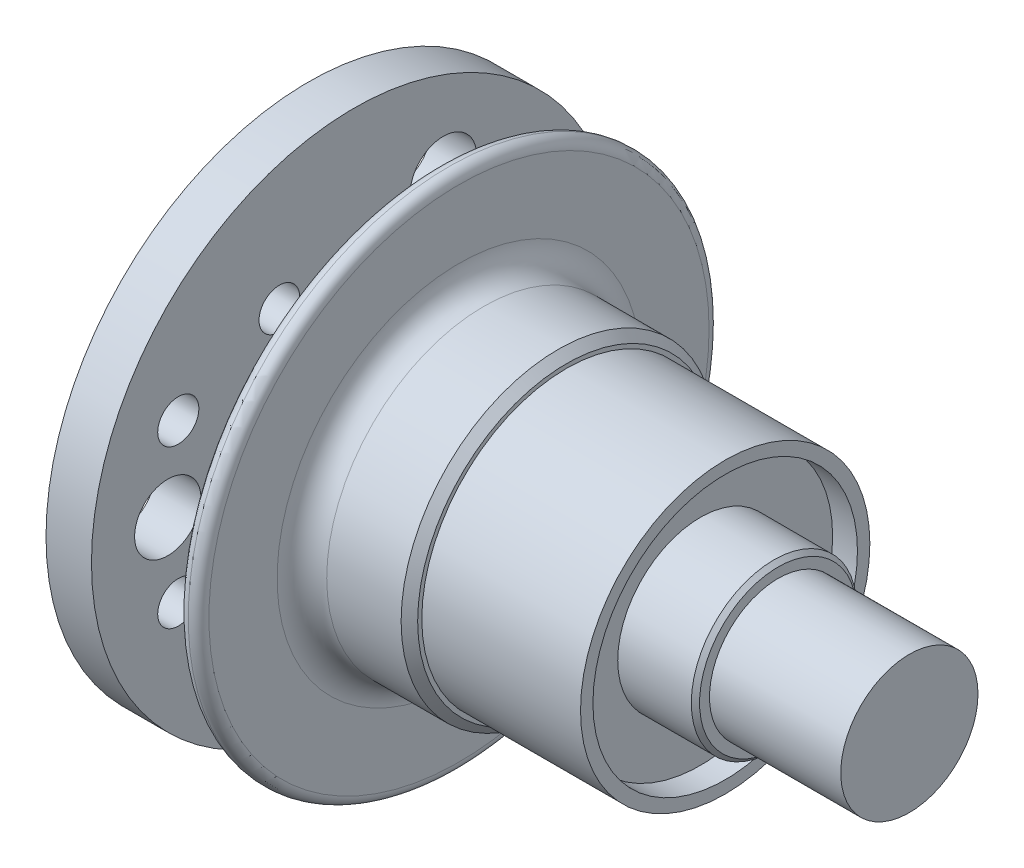
ISO-10303-21;
HEADER;
FILE_DESCRIPTION(('STEP AP214'),'2;1');
FILE_NAME('part.step','',(''),(''),'','','');
FILE_SCHEMA(('AUTOMOTIVE_DESIGN { 1 0 10303 214 1 1 1 1 }'));
ENDSEC;
DATA;
#1=APPLICATION_CONTEXT('core data for automotive mechanical design processes');
#2=APPLICATION_PROTOCOL_DEFINITION('international standard','automotive_design',2000,#1);
#3=PRODUCT_CONTEXT('',#1,'mechanical');
#4=PRODUCT('Part','Part','',(#3));
#5=PRODUCT_RELATED_PRODUCT_CATEGORY('part','',(#4));
#6=PRODUCT_DEFINITION_FORMATION('','',#4);
#7=PRODUCT_DEFINITION_CONTEXT('part definition',#1,'design');
#8=PRODUCT_DEFINITION('design','',#6,#7);
#9=PRODUCT_DEFINITION_SHAPE('','',#8);
#10=(LENGTH_UNIT() NAMED_UNIT(*) SI_UNIT(.MILLI.,.METRE.));
#11=(NAMED_UNIT(*) PLANE_ANGLE_UNIT() SI_UNIT($,.RADIAN.));
#12=(NAMED_UNIT(*) SI_UNIT($,.STERADIAN.) SOLID_ANGLE_UNIT());
#13=UNCERTAINTY_MEASURE_WITH_UNIT(LENGTH_MEASURE(1.E-05),#10,'distance_accuracy_value','');
#14=(GEOMETRIC_REPRESENTATION_CONTEXT(3) GLOBAL_UNCERTAINTY_ASSIGNED_CONTEXT((#13)) GLOBAL_UNIT_ASSIGNED_CONTEXT((#10,
#11,#12)) REPRESENTATION_CONTEXT('',''));
#15=CARTESIAN_POINT('',(0.,0.,0.));
#16=DIRECTION('',(0.,0.,1.));
#17=DIRECTION('',(1.,0.,0.));
#18=AXIS2_PLACEMENT_3D('',#15,#16,#17);
#19=CARTESIAN_POINT('',(20.5,0.,0.));
#20=DIRECTION('',(-1.,0.,0.));
#21=DIRECTION('',(0.,0.,1.));
#22=AXIS2_PLACEMENT_3D('',#19,#20,#21);
#23=CYLINDRICAL_SURFACE('',#22,10.);
#24=CARTESIAN_POINT('',(12.,0.,0.));
#25=DIRECTION('',(-1.,0.,0.));
#26=DIRECTION('',(0.,0.,1.));
#27=AXIS2_PLACEMENT_3D('',#24,#25,#26);
#28=CIRCLE('',#27,10.);
#29=CARTESIAN_POINT('',(12.,0.,10.));
#30=VERTEX_POINT('',#29);
#31=EDGE_CURVE('E53',#30,#30,#28,.F.);
#32=ORIENTED_EDGE('',*,*,#31,.T.);
#33=EDGE_LOOP('',(#32));
#34=FACE_BOUND('',#33,.T.);
#35=CARTESIAN_POINT('',(20.5,0.,0.));
#36=DIRECTION('',(1.,0.,0.));
#37=DIRECTION('',(0.,0.,-1.));
#38=AXIS2_PLACEMENT_3D('',#35,#36,#37);
#39=CIRCLE('',#38,10.);
#40=CARTESIAN_POINT('',(20.5,0.,-10.));
#41=VERTEX_POINT('',#40);
#42=EDGE_CURVE('E151',#41,#41,#39,.T.);
#43=ORIENTED_EDGE('',*,*,#42,.F.);
#44=EDGE_LOOP('',(#43));
#45=FACE_BOUND('',#44,.T.);
#46=ADVANCED_FACE('F45',(#34,#45),#23,.T.);
#47=CARTESIAN_POINT('',(23.,0.,0.));
#48=DIRECTION('',(1.,0.,0.));
#49=DIRECTION('',(0.,0.,-1.));
#50=AXIS2_PLACEMENT_3D('',#47,#48,#49);
#51=PLANE('',#50);
#52=CARTESIAN_POINT('',(23.,0.,0.));
#53=DIRECTION('',(1.,0.,0.));
#54=DIRECTION('',(0.,0.,-1.));
#55=AXIS2_PLACEMENT_3D('',#52,#53,#54);
#56=CIRCLE('',#55,30.25);
#57=CARTESIAN_POINT('',(23.,0.,-30.25));
#58=VERTEX_POINT('',#57);
#59=EDGE_CURVE('E58',#58,#58,#56,.T.);
#60=ORIENTED_EDGE('',*,*,#59,.T.);
#61=EDGE_LOOP('',(#60));
#62=FACE_BOUND('',#61,.T.);
#63=CARTESIAN_POINT('',(23.,0.,0.));
#64=DIRECTION('',(1.,0.,0.));
#65=DIRECTION('',(0.,0.,-1.));
#66=AXIS2_PLACEMENT_3D('',#63,#64,#65);
#67=CIRCLE('',#66,22.);
#68=CARTESIAN_POINT('',(23.,0.,-22.));
#69=VERTEX_POINT('',#68);
#70=EDGE_CURVE('E174',#69,#69,#67,.F.);
#71=ORIENTED_EDGE('',*,*,#70,.T.);
#72=EDGE_LOOP('',(#71));
#73=FACE_BOUND('',#72,.T.);
#74=ADVANCED_FACE('F202',(#62,#73),#51,.T.);
#75=CARTESIAN_POINT('',(20.5,0.,0.));
#76=DIRECTION('',(1.,0.,0.));
#77=DIRECTION('',(0.,0.,-1.));
#78=AXIS2_PLACEMENT_3D('',#75,#76,#77);
#79=PLANE('',#78);
#80=CARTESIAN_POINT('',(20.5,0.,0.));
#81=DIRECTION('',(1.,0.,0.));
#82=DIRECTION('',(0.,0.,-1.));
#83=AXIS2_PLACEMENT_3D('',#80,#81,#82);
#84=CIRCLE('',#83,30.25);
#85=CARTESIAN_POINT('',(20.5,0.,-30.25));
#86=VERTEX_POINT('',#85);
#87=EDGE_CURVE('E177',#86,#86,#84,.F.);
#88=ORIENTED_EDGE('',*,*,#87,.T.);
#89=EDGE_LOOP('',(#88));
#90=FACE_BOUND('',#89,.T.);
#91=ORIENTED_EDGE('',*,*,#42,.T.);
#92=EDGE_LOOP('',(#91));
#93=FACE_BOUND('',#92,.T.);
#94=ADVANCED_FACE('F208',(#90,#93),#79,.F.);
#95=CARTESIAN_POINT('',(36.,0.,0.));
#96=DIRECTION('',(-1.,0.,0.));
#97=DIRECTION('',(0.,0.,1.));
#98=AXIS2_PLACEMENT_3D('',#95,#96,#97);
#99=CYLINDRICAL_SURFACE('',#98,19.);
#100=CARTESIAN_POINT('',(26.,0.,0.));
#101=DIRECTION('',(1.,0.,0.));
#102=DIRECTION('',(0.,0.,-1.));
#103=AXIS2_PLACEMENT_3D('',#100,#101,#102);
#104=CIRCLE('',#103,19.);
#105=CARTESIAN_POINT('',(26.,0.,19.));
#106=VERTEX_POINT('',#105);
#107=EDGE_CURVE('E171',#106,#106,#104,.T.);
#108=CARTESIAN_POINT('',(35.0000000000001,0.,0.));
#109=DIRECTION('',(1.,0.,0.));
#110=DIRECTION('',(0.,0.,-1.));
#111=AXIS2_PLACEMENT_3D('',#108,#109,#110);
#112=CIRCLE('',#111,19.);
#113=CARTESIAN_POINT('',(35.0000000000001,0.,19.));
#114=VERTEX_POINT('',#113);
#115=EDGE_CURVE('E131',#114,#114,#112,.F.);
#116=CARTESIAN_POINT('',(26.,0.,19.));
#117=CARTESIAN_POINT('',(26.09375,0.,19.));
#118=CARTESIAN_POINT('',(26.1875,0.,19.));
#119=CARTESIAN_POINT('',(26.375,0.,19.));
#120=CARTESIAN_POINT('',(26.46875,0.,19.));
#121=CARTESIAN_POINT('',(26.65625,0.,19.));
#122=CARTESIAN_POINT('',(26.75,0.,19.));
#123=CARTESIAN_POINT('',(26.9375,0.,19.));
#124=CARTESIAN_POINT('',(27.03125,0.,19.));
#125=CARTESIAN_POINT('',(27.21875,0.,19.));
#126=CARTESIAN_POINT('',(27.3125,0.,19.));
#127=CARTESIAN_POINT('',(27.5,0.,19.));
#128=CARTESIAN_POINT('',(27.59375,0.,19.));
#129=CARTESIAN_POINT('',(27.78125,0.,19.));
#130=CARTESIAN_POINT('',(27.875,0.,19.));
#131=CARTESIAN_POINT('',(28.0625,0.,19.));
#132=CARTESIAN_POINT('',(28.15625,0.,19.));
#133=CARTESIAN_POINT('',(28.34375,0.,19.));
#134=CARTESIAN_POINT('',(28.4375,0.,19.));
#135=CARTESIAN_POINT('',(28.625,0.,19.));
#136=CARTESIAN_POINT('',(28.71875,0.,19.));
#137=CARTESIAN_POINT('',(28.90625,0.,19.));
#138=CARTESIAN_POINT('',(29.,0.,19.));
#139=CARTESIAN_POINT('',(29.1875,0.,19.));
#140=CARTESIAN_POINT('',(29.28125,0.,19.));
#141=CARTESIAN_POINT('',(29.46875,0.,19.));
#142=CARTESIAN_POINT('',(29.5625,0.,19.));
#143=CARTESIAN_POINT('',(29.75,0.,19.));
#144=CARTESIAN_POINT('',(29.84375,0.,19.));
#145=CARTESIAN_POINT('',(30.03125,0.,19.));
#146=CARTESIAN_POINT('',(30.125,0.,19.));
#147=CARTESIAN_POINT('',(30.3125,0.,19.));
#148=CARTESIAN_POINT('',(30.40625,0.,19.));
#149=CARTESIAN_POINT('',(30.59375,0.,19.));
#150=CARTESIAN_POINT('',(30.6875000000001,0.,19.));
#151=CARTESIAN_POINT('',(30.8750000000001,0.,19.));
#152=CARTESIAN_POINT('',(30.9687500000001,0.,19.));
#153=CARTESIAN_POINT('',(31.1562500000001,0.,19.));
#154=CARTESIAN_POINT('',(31.2500000000001,0.,19.));
#155=CARTESIAN_POINT('',(31.4375000000001,0.,19.));
#156=CARTESIAN_POINT('',(31.5312500000001,0.,19.));
#157=CARTESIAN_POINT('',(31.7187500000001,0.,19.));
#158=CARTESIAN_POINT('',(31.8125000000001,0.,19.));
#159=CARTESIAN_POINT('',(32.0000000000001,0.,19.));
#160=CARTESIAN_POINT('',(32.0937500000001,0.,19.));
#161=CARTESIAN_POINT('',(32.2812500000001,0.,19.));
#162=CARTESIAN_POINT('',(32.3750000000001,0.,19.));
#163=CARTESIAN_POINT('',(32.5625000000001,0.,19.));
#164=CARTESIAN_POINT('',(32.6562500000001,0.,19.));
#165=CARTESIAN_POINT('',(32.8437500000001,0.,19.));
#166=CARTESIAN_POINT('',(32.9375000000001,0.,19.));
#167=CARTESIAN_POINT('',(33.1250000000001,0.,19.));
#168=CARTESIAN_POINT('',(33.2187500000001,0.,19.));
#169=CARTESIAN_POINT('',(33.4062500000001,0.,19.));
#170=CARTESIAN_POINT('',(33.5000000000001,0.,19.));
#171=CARTESIAN_POINT('',(33.6875000000001,0.,19.));
#172=CARTESIAN_POINT('',(33.7812500000001,0.,19.));
#173=CARTESIAN_POINT('',(33.9687500000001,0.,19.));
#174=CARTESIAN_POINT('',(34.0625000000001,0.,19.));
#175=CARTESIAN_POINT('',(34.2500000000001,0.,19.));
#176=CARTESIAN_POINT('',(34.3437500000001,0.,19.));
#177=CARTESIAN_POINT('',(34.5312500000001,0.,19.));
#178=CARTESIAN_POINT('',(34.6250000000001,0.,19.));
#179=CARTESIAN_POINT('',(34.8125000000001,0.,19.));
#180=CARTESIAN_POINT('',(34.9062500000001,0.,19.));
#181=CARTESIAN_POINT('',(35.0000000000001,0.,19.));
#182=B_SPLINE_CURVE_WITH_KNOTS('',3,(#116,#117,#118,#119,#120,#121,#122,#123,#124,#125,#126,
#127,#128,#129,#130,#131,#132,#133,#134,#135,#136,#137,#138,#139,#140,#141,#142,#143,#144,#145,
#146,#147,#148,#149,#150,#151,#152,#153,#154,#155,#156,#157,#158,#159,#160,#161,#162,#163,#164,
#165,#166,#167,#168,#169,#170,#171,#172,#173,#174,#175,#176,#177,#178,#179,#180,#181),
.UNSPECIFIED.,.F.,.F.,(4,2,2,2,2,2,2,2,2,2,2,2,2,2,2,2,2,2,2,2,2,2,2,2,2,2,2,2,2,2,2,2,4),(0.,
0.281250000000004,0.562500000000007,0.843750000000011,1.12500000000001,1.40625000000002,
1.68750000000002,1.96875000000003,2.25000000000003,2.53125000000003,2.81250000000003,
3.09375000000004,3.37500000000004,3.65625000000004,3.93750000000005,4.21875000000005,
4.50000000000006,4.78125000000006,5.06250000000006,5.34375000000007,5.62500000000007,
5.90625000000008,6.18750000000008,6.46875000000009,6.75000000000009,7.03125000000009,
7.3125000000001,7.5937500000001,7.8750000000001,8.15625000000011,8.43750000000011,
8.71875000000012,9.00000000000012),.UNSPECIFIED.);
#183=EDGE_CURVE('BSEAM271',#106,#114,#182,.T.);
#184=ORIENTED_EDGE('',*,*,#107,.T.);
#185=ORIENTED_EDGE('',*,*,#115,.T.);
#186=ORIENTED_EDGE('',*,*,#183,.T.);
#187=ORIENTED_EDGE('',*,*,#183,.F.);
#188=EDGE_LOOP('',(#184,#186,#185,#187));
#189=FACE_BOUND('',#188,.T.);
#190=ADVANCED_FACE('F271',(#189),#99,.T.);
#191=CARTESIAN_POINT('',(36.,0.,0.));
#192=DIRECTION('',(1.,0.,0.));
#193=DIRECTION('',(0.,0.,-1.));
#194=AXIS2_PLACEMENT_3D('',#191,#192,#193);
#195=PLANE('',#194);
#196=CARTESIAN_POINT('',(36.,0.,0.));
#197=DIRECTION('',(1.,0.,0.));
#198=DIRECTION('',(0.,0.,-1.));
#199=AXIS2_PLACEMENT_3D('',#196,#197,#198);
#200=CIRCLE('',#199,18.0000000000001);
#201=CARTESIAN_POINT('',(36.,0.,-18.0000000000001));
#202=VERTEX_POINT('',#201);
#203=EDGE_CURVE('E161',#202,#202,#200,.T.);
#204=ORIENTED_EDGE('',*,*,#203,.T.);
#205=EDGE_LOOP('',(#204));
#206=FACE_BOUND('',#205,.T.);
#207=CARTESIAN_POINT('',(36.,0.,0.));
#208=DIRECTION('',(1.,0.,0.));
#209=DIRECTION('',(0.,0.,-1.));
#210=AXIS2_PLACEMENT_3D('',#207,#208,#209);
#211=CIRCLE('',#210,17.5);
#212=CARTESIAN_POINT('',(36.,0.,-17.5));
#213=VERTEX_POINT('',#212);
#214=EDGE_CURVE('E147',#213,#213,#211,.T.);
#215=ORIENTED_EDGE('',*,*,#214,.F.);
#216=EDGE_LOOP('',(#215));
#217=FACE_BOUND('',#216,.T.);
#218=ADVANCED_FACE('F267',(#206,#217),#195,.T.);
#219=CARTESIAN_POINT('',(55.2,0.,0.));
#220=DIRECTION('',(-1.,0.,0.));
#221=DIRECTION('',(0.,0.,1.));
#222=AXIS2_PLACEMENT_3D('',#219,#220,#221);
#223=CYLINDRICAL_SURFACE('',#222,17.5);
#224=CARTESIAN_POINT('',(55.2,0.,0.));
#225=DIRECTION('',(1.,0.,0.));
#226=DIRECTION('',(0.,0.,-1.));
#227=AXIS2_PLACEMENT_3D('',#224,#225,#226);
#228=CIRCLE('',#227,17.5);
#229=CARTESIAN_POINT('',(55.2,0.,-17.5));
#230=VERTEX_POINT('',#229);
#231=EDGE_CURVE('E143',#230,#230,#228,.T.);
#232=ORIENTED_EDGE('',*,*,#231,.F.);
#233=EDGE_LOOP('',(#232));
#234=FACE_BOUND('',#233,.T.);
#235=ORIENTED_EDGE('',*,*,#214,.T.);
#236=EDGE_LOOP('',(#235));
#237=FACE_BOUND('',#236,.T.);
#238=ADVANCED_FACE('F263',(#234,#237),#223,.T.);
#239=CARTESIAN_POINT('',(55.2,0.,0.));
#240=DIRECTION('',(1.,0.,0.));
#241=DIRECTION('',(0.,0.,-1.));
#242=AXIS2_PLACEMENT_3D('',#239,#240,#241);
#243=PLANE('',#242);
#244=CARTESIAN_POINT('',(55.2,0.,0.));
#245=DIRECTION('',(1.,0.,0.));
#246=DIRECTION('',(0.,0.,-1.));
#247=AXIS2_PLACEMENT_3D('',#244,#245,#246);
#248=CIRCLE('',#247,16.);
#249=CARTESIAN_POINT('',(55.2,0.,-16.));
#250=VERTEX_POINT('',#249);
#251=EDGE_CURVE('E135',#250,#250,#248,.T.);
#252=ORIENTED_EDGE('',*,*,#251,.F.);
#253=EDGE_LOOP('',(#252));
#254=FACE_BOUND('',#253,.T.);
#255=ORIENTED_EDGE('',*,*,#231,.T.);
#256=EDGE_LOOP('',(#255));
#257=FACE_BOUND('',#256,.T.);
#258=ADVANCED_FACE('F259',(#254,#257),#243,.T.);
#259=CARTESIAN_POINT('',(52.2,0.,0.));
#260=DIRECTION('',(-1.,0.,0.));
#261=DIRECTION('',(0.,0.,1.));
#262=AXIS2_PLACEMENT_3D('',#259,#260,#261);
#263=PLANE('',#262);
#264=CARTESIAN_POINT('',(52.2,0.,0.));
#265=DIRECTION('',(-1.,0.,0.));
#266=DIRECTION('',(0.,0.,1.));
#267=AXIS2_PLACEMENT_3D('',#264,#265,#266);
#268=CIRCLE('',#267,10.);
#269=CARTESIAN_POINT('',(52.2,0.,10.));
#270=VERTEX_POINT('',#269);
#271=EDGE_CURVE('E150',#270,#270,#268,.F.);
#272=ORIENTED_EDGE('',*,*,#271,.F.);
#273=EDGE_LOOP('',(#272));
#274=FACE_BOUND('',#273,.T.);
#275=CARTESIAN_POINT('',(52.2,0.,0.));
#276=DIRECTION('',(1.,0.,0.));
#277=DIRECTION('',(0.,0.,-1.));
#278=AXIS2_PLACEMENT_3D('',#275,#276,#277);
#279=CIRCLE('',#278,16.);
#280=CARTESIAN_POINT('',(52.2,0.,-16.));
#281=VERTEX_POINT('',#280);
#282=EDGE_CURVE('E140',#281,#281,#279,.T.);
#283=ORIENTED_EDGE('',*,*,#282,.T.);
#284=EDGE_LOOP('',(#283));
#285=FACE_BOUND('',#284,.T.);
#286=ADVANCED_FACE('F255',(#274,#285),#263,.F.);
#287=CARTESIAN_POINT('',(55.2,0.,0.));
#288=DIRECTION('',(1.,0.,0.));
#289=DIRECTION('',(0.,0.,-1.));
#290=AXIS2_PLACEMENT_3D('',#287,#288,#289);
#291=CYLINDRICAL_SURFACE('',#290,16.);
#292=ORIENTED_EDGE('',*,*,#282,.F.);
#293=EDGE_LOOP('',(#292));
#294=FACE_BOUND('',#293,.T.);
#295=ORIENTED_EDGE('',*,*,#251,.T.);
#296=EDGE_LOOP('',(#295));
#297=FACE_BOUND('',#296,.T.);
#298=ADVANCED_FACE('F247',(#294,#297),#291,.F.);
#299=CARTESIAN_POINT('',(61.6,0.,0.));
#300=DIRECTION('',(-1.,0.,0.));
#301=DIRECTION('',(0.,0.,1.));
#302=AXIS2_PLACEMENT_3D('',#299,#300,#301);
#303=CYLINDRICAL_SURFACE('',#302,10.);
#304=CARTESIAN_POINT('',(61.1,0.,0.));
#305=DIRECTION('',(1.,0.,0.));
#306=DIRECTION('',(0.,0.,-1.));
#307=AXIS2_PLACEMENT_3D('',#304,#305,#306);
#308=CIRCLE('',#307,10.);
#309=CARTESIAN_POINT('',(61.1,0.,-10.));
#310=VERTEX_POINT('',#309);
#311=EDGE_CURVE('E168',#310,#310,#308,.F.);
#312=ORIENTED_EDGE('',*,*,#311,.T.);
#313=EDGE_LOOP('',(#312));
#314=FACE_BOUND('',#313,.T.);
#315=ORIENTED_EDGE('',*,*,#271,.T.);
#316=EDGE_LOOP('',(#315));
#317=FACE_BOUND('',#316,.T.);
#318=ADVANCED_FACE('F240',(#314,#317),#303,.T.);
#319=CARTESIAN_POINT('',(61.6,0.,0.));
#320=DIRECTION('',(1.,0.,0.));
#321=DIRECTION('',(0.,0.,-1.));
#322=AXIS2_PLACEMENT_3D('',#319,#320,#321);
#323=PLANE('',#322);
#324=CARTESIAN_POINT('',(61.6,0.,0.));
#325=DIRECTION('',(1.,0.,0.));
#326=DIRECTION('',(0.,0.,-1.));
#327=AXIS2_PLACEMENT_3D('',#324,#325,#326);
#328=CIRCLE('',#327,9.50000000000001);
#329=CARTESIAN_POINT('',(61.6,0.,-9.50000000000001));
#330=VERTEX_POINT('',#329);
#331=EDGE_CURVE('E130',#330,#330,#328,.T.);
#332=ORIENTED_EDGE('',*,*,#331,.T.);
#333=EDGE_LOOP('',(#332));
#334=FACE_BOUND('',#333,.T.);
#335=CARTESIAN_POINT('',(61.6,0.,0.));
#336=DIRECTION('',(1.,0.,0.));
#337=DIRECTION('',(0.,0.,-1.));
#338=AXIS2_PLACEMENT_3D('',#335,#336,#337);
#339=CIRCLE('',#338,8.3);
#340=CARTESIAN_POINT('',(61.6,0.,-8.3));
#341=VERTEX_POINT('',#340);
#342=EDGE_CURVE('E127',#341,#341,#339,.T.);
#343=ORIENTED_EDGE('',*,*,#342,.F.);
#344=EDGE_LOOP('',(#343));
#345=FACE_BOUND('',#344,.T.);
#346=ADVANCED_FACE('F222',(#334,#345),#323,.T.);
#347=CARTESIAN_POINT('',(36.,0.,0.));
#348=DIRECTION('',(-1.,0.,0.));
#349=DIRECTION('',(0.,0.,1.));
#350=AXIS2_PLACEMENT_3D('',#347,#348,#349);
#351=CONICAL_SURFACE('',#350,18.0000000000001,0.785398163397445);
#352=ORIENTED_EDGE('',*,*,#115,.F.);
#353=EDGE_LOOP('',(#352));
#354=FACE_BOUND('',#353,.T.);
#355=ORIENTED_EDGE('',*,*,#203,.F.);
#356=EDGE_LOOP('',(#355));
#357=FACE_BOUND('',#356,.T.);
#358=ADVANCED_FACE('F215',(#354,#357),#351,.T.);
#359=CARTESIAN_POINT('',(77.48,0.,0.));
#360=DIRECTION('',(1.,0.,0.));
#361=DIRECTION('',(0.,0.,-1.));
#362=AXIS2_PLACEMENT_3D('',#359,#360,#361);
#363=PLANE('',#362);
#364=CARTESIAN_POINT('',(77.48,0.,0.));
#365=DIRECTION('',(1.,0.,0.));
#366=DIRECTION('',(0.,0.,-1.));
#367=AXIS2_PLACEMENT_3D('',#364,#365,#366);
#368=CIRCLE('',#367,8.3);
#369=CARTESIAN_POINT('',(77.48,0.,-8.3));
#370=VERTEX_POINT('',#369);
#371=EDGE_CURVE('E123',#370,#370,#368,.T.);
#372=ORIENTED_EDGE('',*,*,#371,.T.);
#373=EDGE_LOOP('',(#372));
#374=FACE_BOUND('',#373,.T.);
#375=ADVANCED_FACE('F221',(#374),#363,.T.);
#376=CARTESIAN_POINT('',(77.48,0.,0.));
#377=DIRECTION('',(-1.,0.,0.));
#378=DIRECTION('',(0.,0.,1.));
#379=AXIS2_PLACEMENT_3D('',#376,#377,#378);
#380=CYLINDRICAL_SURFACE('',#379,8.3);
#381=ORIENTED_EDGE('',*,*,#371,.F.);
#382=EDGE_LOOP('',(#381));
#383=FACE_BOUND('',#382,.T.);
#384=ORIENTED_EDGE('',*,*,#342,.T.);
#385=EDGE_LOOP('',(#384));
#386=FACE_BOUND('',#385,.T.);
#387=ADVANCED_FACE('F227',(#383,#386),#380,.T.);
#388=CARTESIAN_POINT('',(61.6,0.,0.));
#389=DIRECTION('',(-1.,0.,0.));
#390=DIRECTION('',(0.,0.,1.));
#391=AXIS2_PLACEMENT_3D('',#388,#389,#390);
#392=CONICAL_SURFACE('',#391,9.50000000000001,0.785398163397459);
#393=ORIENTED_EDGE('',*,*,#311,.F.);
#394=EDGE_LOOP('',(#393));
#395=FACE_BOUND('',#394,.T.);
#396=ORIENTED_EDGE('',*,*,#331,.F.);
#397=EDGE_LOOP('',(#396));
#398=FACE_BOUND('',#397,.T.);
#399=ADVANCED_FACE('F197',(#395,#398),#392,.T.);
#400=CARTESIAN_POINT('',(26.,0.,0.));
#401=DIRECTION('',(1.,0.,0.));
#402=DIRECTION('',(0.,0.,-1.));
#403=AXIS2_PLACEMENT_3D('',#400,#401,#402);
#404=TOROIDAL_SURFACE('',#403,22.,3.);
#405=ORIENTED_EDGE('',*,*,#70,.F.);
#406=EDGE_LOOP('',(#405));
#407=FACE_BOUND('',#406,.T.);
#408=ORIENTED_EDGE('',*,*,#107,.F.);
#409=EDGE_LOOP('',(#408));
#410=FACE_BOUND('',#409,.T.);
#411=ADVANCED_FACE('F189',(#407,#410),#404,.F.);
#412=CARTESIAN_POINT('',(21.75,0.,0.));
#413=DIRECTION('',(1.,0.,0.));
#414=DIRECTION('',(0.,0.,-1.));
#415=AXIS2_PLACEMENT_3D('',#412,#413,#414);
#416=TOROIDAL_SURFACE('',#415,30.25,1.25);
#417=ORIENTED_EDGE('',*,*,#59,.F.);
#418=EDGE_LOOP('',(#417));
#419=FACE_BOUND('',#418,.T.);
#420=CARTESIAN_POINT('',(21.75,0.,0.));
#421=DIRECTION('',(1.,0.,0.));
#422=DIRECTION('',(0.,0.,-1.));
#423=AXIS2_PLACEMENT_3D('',#420,#421,#422);
#424=CIRCLE('',#423,31.5);
#425=CARTESIAN_POINT('',(21.75,0.,-31.5));
#426=VERTEX_POINT('',#425);
#427=EDGE_CURVE('E65',#426,#426,#424,.F.);
#428=ORIENTED_EDGE('',*,*,#427,.F.);
#429=EDGE_LOOP('',(#428));
#430=FACE_BOUND('',#429,.T.);
#431=ADVANCED_FACE('F187',(#419,#430),#416,.T.);
#432=CARTESIAN_POINT('',(21.75,0.,0.));
#433=DIRECTION('',(1.,0.,0.));
#434=DIRECTION('',(0.,0.,-1.));
#435=AXIS2_PLACEMENT_3D('',#432,#433,#434);
#436=TOROIDAL_SURFACE('',#435,30.25,1.25);
#437=ORIENTED_EDGE('',*,*,#427,.T.);
#438=EDGE_LOOP('',(#437));
#439=FACE_BOUND('',#438,.T.);
#440=ORIENTED_EDGE('',*,*,#87,.F.);
#441=EDGE_LOOP('',(#440));
#442=FACE_BOUND('',#441,.T.);
#443=ADVANCED_FACE('F184',(#439,#442),#436,.T.);
#444=CARTESIAN_POINT('',(61.6,0.,0.));
#445=DIRECTION('',(1.,0.,0.));
#446=DIRECTION('',(0.,0.,-1.));
#447=AXIS2_PLACEMENT_3D('',#444,#445,#446);
#448=PLANE('',#447);
#449=CARTESIAN_POINT('',(61.6,0.,0.));
#450=DIRECTION('',(-1.,0.,0.));
#451=DIRECTION('',(0.,0.,-1.));
#452=AXIS2_PLACEMENT_3D('',#449,#450,#451);
#453=CIRCLE('',#452,3.9624);
#454=CARTESIAN_POINT('',(61.6,0.,-3.9624));
#455=VERTEX_POINT('',#454);
#456=EDGE_CURVE('E132',#455,#455,#453,.T.);
#457=ORIENTED_EDGE('',*,*,#456,.T.);
#458=EDGE_LOOP('',(#457));
#459=FACE_BOUND('',#458,.T.);
#460=ADVANCED_FACE('F195',(#459),#448,.F.);
#461=CARTESIAN_POINT('',(61.6,0.,0.));
#462=DIRECTION('',(-1.,0.,0.));
#463=DIRECTION('',(0.,0.,1.));
#464=AXIS2_PLACEMENT_3D('',#461,#462,#463);
#465=CYLINDRICAL_SURFACE('',#464,3.9624);
#466=ORIENTED_EDGE('',*,*,#456,.F.);
#467=EDGE_LOOP('',(#466));
#468=FACE_BOUND('',#467,.T.);
#469=CARTESIAN_POINT('',(4.5,0.,0.));
#470=DIRECTION('',(-1.,0.,0.));
#471=DIRECTION('',(0.,0.,-1.));
#472=AXIS2_PLACEMENT_3D('',#469,#470,#471);
#473=CIRCLE('',#472,3.9624);
#474=CARTESIAN_POINT('',(4.5,0.,-3.9624));
#475=VERTEX_POINT('',#474);
#476=EDGE_CURVE('E126',#475,#475,#473,.T.);
#477=ORIENTED_EDGE('',*,*,#476,.T.);
#478=EDGE_LOOP('',(#477));
#479=FACE_BOUND('',#478,.T.);
#480=ADVANCED_FACE('F251',(#468,#479),#465,.F.);
#481=CARTESIAN_POINT('',(4.5,-0.133603699847063,-0.294530854113033));
#482=DIRECTION('',(-1.,0.,0.));
#483=DIRECTION('',(0.,0.,1.));
#484=AXIS2_PLACEMENT_3D('',#481,#482,#483);
#485=PLANE('',#484);
#486=CARTESIAN_POINT('',(4.5,-9.525,20.955));
#487=DIRECTION('',(-1.,0.,0.));
#488=DIRECTION('',(0.,0.,1.));
#489=AXIS2_PLACEMENT_3D('',#486,#487,#488);
#490=CIRCLE('',#489,2.4892);
#491=CARTESIAN_POINT('',(4.5,-9.525,23.4442));
#492=VERTEX_POINT('',#491);
#493=EDGE_CURVE('E106',#492,#492,#490,.T.);
#494=ORIENTED_EDGE('',*,*,#493,.F.);
#495=EDGE_LOOP('',(#494));
#496=FACE_BOUND('',#495,.T.);
#497=CARTESIAN_POINT('',(4.5,9.525,20.955));
#498=DIRECTION('',(-1.,0.,0.));
#499=DIRECTION('',(0.,0.,1.));
#500=AXIS2_PLACEMENT_3D('',#497,#498,#499);
#501=CIRCLE('',#500,2.4892);
#502=CARTESIAN_POINT('',(4.5,9.525,23.4442));
#503=VERTEX_POINT('',#502);
#504=EDGE_CURVE('E96',#503,#503,#501,.T.);
#505=ORIENTED_EDGE('',*,*,#504,.F.);
#506=EDGE_LOOP('',(#505));
#507=FACE_BOUND('',#506,.T.);
#508=CARTESIAN_POINT('',(4.5,9.525,-20.955));
#509=DIRECTION('',(-1.,0.,0.));
#510=DIRECTION('',(0.,0.,1.));
#511=AXIS2_PLACEMENT_3D('',#508,#509,#510);
#512=CIRCLE('',#511,2.4892);
#513=CARTESIAN_POINT('',(4.5,9.525,-18.4658));
#514=VERTEX_POINT('',#513);
#515=EDGE_CURVE('E93',#514,#514,#512,.T.);
#516=ORIENTED_EDGE('',*,*,#515,.F.);
#517=EDGE_LOOP('',(#516));
#518=FACE_BOUND('',#517,.T.);
#519=CARTESIAN_POINT('',(4.5,-9.525,-20.955));
#520=DIRECTION('',(-1.,0.,0.));
#521=DIRECTION('',(0.,0.,1.));
#522=AXIS2_PLACEMENT_3D('',#519,#520,#521);
#523=CIRCLE('',#522,2.4892);
#524=CARTESIAN_POINT('',(4.5,-9.525,-18.4658));
#525=VERTEX_POINT('',#524);
#526=EDGE_CURVE('E90',#525,#525,#523,.T.);
#527=ORIENTED_EDGE('',*,*,#526,.F.);
#528=EDGE_LOOP('',(#527));
#529=FACE_BOUND('',#528,.T.);
#530=CARTESIAN_POINT('',(4.5,0.,22.225));
#531=DIRECTION('',(-1.,0.,0.));
#532=DIRECTION('',(0.,0.,1.));
#533=AXIS2_PLACEMENT_3D('',#530,#531,#532);
#534=CIRCLE('',#533,4.0132);
#535=CARTESIAN_POINT('',(4.5,0.,26.2382));
#536=VERTEX_POINT('',#535);
#537=EDGE_CURVE('E86',#536,#536,#534,.T.);
#538=ORIENTED_EDGE('',*,*,#537,.F.);
#539=EDGE_LOOP('',(#538));
#540=FACE_BOUND('',#539,.T.);
#541=CARTESIAN_POINT('',(4.5,-19.2474145991092,-11.1124999999999));
#542=DIRECTION('',(-1.,0.,0.));
#543=DIRECTION('',(0.,0.,1.));
#544=AXIS2_PLACEMENT_3D('',#541,#542,#543);
#545=CIRCLE('',#544,4.0132);
#546=CARTESIAN_POINT('',(4.5,-19.2474145991092,-7.09929999999995));
#547=VERTEX_POINT('',#546);
#548=EDGE_CURVE('E82',#547,#547,#545,.T.);
#549=ORIENTED_EDGE('',*,*,#548,.F.);
#550=EDGE_LOOP('',(#549));
#551=FACE_BOUND('',#550,.T.);
#552=CARTESIAN_POINT('',(4.5,19.2474145991092,-11.1125));
#553=DIRECTION('',(-1.,0.,0.));
#554=DIRECTION('',(0.,0.,1.));
#555=AXIS2_PLACEMENT_3D('',#552,#553,#554);
#556=CIRCLE('',#555,4.0132);
#557=CARTESIAN_POINT('',(4.5,19.2474145991092,-7.09929999999995));
#558=VERTEX_POINT('',#557);
#559=EDGE_CURVE('E78',#558,#558,#556,.T.);
#560=ORIENTED_EDGE('',*,*,#559,.F.);
#561=EDGE_LOOP('',(#560));
#562=FACE_BOUND('',#561,.T.);
#563=CARTESIAN_POINT('',(4.5,15.1229686135858,8.73124999999996));
#564=DIRECTION('',(-1.,0.,0.));
#565=DIRECTION('',(0.,0.,1.));
#566=AXIS2_PLACEMENT_3D('',#563,#564,#565);
#567=CIRCLE('',#566,2.45744999999999);
#568=CARTESIAN_POINT('',(4.5,15.1229686135858,11.1886999999999));
#569=VERTEX_POINT('',#568);
#570=EDGE_CURVE('E74',#569,#569,#567,.T.);
#571=ORIENTED_EDGE('',*,*,#570,.F.);
#572=EDGE_LOOP('',(#571));
#573=FACE_BOUND('',#572,.T.);
#574=CARTESIAN_POINT('',(4.5,0.,-17.4625));
#575=DIRECTION('',(-1.,0.,0.));
#576=DIRECTION('',(0.,0.,1.));
#577=AXIS2_PLACEMENT_3D('',#574,#575,#576);
#578=CIRCLE('',#577,2.45744999999999);
#579=CARTESIAN_POINT('',(4.5,0.,-15.00505));
#580=VERTEX_POINT('',#579);
#581=EDGE_CURVE('E70',#580,#580,#578,.T.);
#582=ORIENTED_EDGE('',*,*,#581,.F.);
#583=EDGE_LOOP('',(#582));
#584=FACE_BOUND('',#583,.T.);
#585=CARTESIAN_POINT('',(4.5,-15.1229686135857,8.73125000000008));
#586=DIRECTION('',(-1.,0.,0.));
#587=DIRECTION('',(0.,0.,1.));
#588=AXIS2_PLACEMENT_3D('',#585,#586,#587);
#589=CIRCLE('',#588,2.45744999999999);
#590=CARTESIAN_POINT('',(4.5,-15.1229686135857,11.1887000000001));
#591=VERTEX_POINT('',#590);
#592=EDGE_CURVE('E66',#591,#591,#589,.T.);
#593=ORIENTED_EDGE('',*,*,#592,.F.);
#594=EDGE_LOOP('',(#593));
#595=FACE_BOUND('',#594,.T.);
#596=ORIENTED_EDGE('',*,*,#476,.F.);
#597=EDGE_LOOP('',(#596));
#598=FACE_BOUND('',#597,.T.);
#599=CARTESIAN_POINT('',(4.5,-0.133603699847063,-0.294530854113033));
#600=DIRECTION('',(1.,0.,0.));
#601=DIRECTION('',(0.,0.,1.));
#602=AXIS2_PLACEMENT_3D('',#599,#600,#601);
#603=CIRCLE('',#602,31.75);
#604=CARTESIAN_POINT('',(4.5,-0.133603699847063,31.455469145887));
#605=VERTEX_POINT('',#604);
#606=EDGE_CURVE('E152',#605,#605,#603,.T.);
#607=ORIENTED_EDGE('',*,*,#606,.F.);
#608=EDGE_LOOP('',(#607));
#609=FACE_BOUND('',#608,.T.);
#610=ADVANCED_FACE('F276',(#496,#507,#518,#529,#540,#551,#562,#573,#584,#595,#598,#609),#485,.T.);
#611=CARTESIAN_POINT('',(4.5,-0.133603699847063,-0.294530854113033));
#612=DIRECTION('',(1.,0.,0.));
#613=DIRECTION('',(0.,0.,-1.));
#614=AXIS2_PLACEMENT_3D('',#611,#612,#613);
#615=CYLINDRICAL_SURFACE('',#614,31.75);
#616=ORIENTED_EDGE('',*,*,#606,.T.);
#617=EDGE_LOOP('',(#616));
#618=FACE_BOUND('',#617,.T.);
#619=CARTESIAN_POINT('',(10.,-0.133603699847063,-0.294530854113033));
#620=DIRECTION('',(1.,0.,0.));
#621=DIRECTION('',(0.,0.,1.));
#622=AXIS2_PLACEMENT_3D('',#619,#620,#621);
#623=CIRCLE('',#622,31.75);
#624=CARTESIAN_POINT('',(10.,-0.133603699847063,31.455469145887));
#625=VERTEX_POINT('',#624);
#626=EDGE_CURVE('E146',#625,#625,#623,.T.);
#627=ORIENTED_EDGE('',*,*,#626,.F.);
#628=EDGE_LOOP('',(#627));
#629=FACE_BOUND('',#628,.T.);
#630=ADVANCED_FACE('F279',(#618,#629),#615,.T.);
#631=CARTESIAN_POINT('',(10.,-0.133603699847063,-0.294530854113033));
#632=DIRECTION('',(-1.,0.,0.));
#633=DIRECTION('',(0.,0.,1.));
#634=AXIS2_PLACEMENT_3D('',#631,#632,#633);
#635=PLANE('',#634);
#636=CARTESIAN_POINT('',(10.,-9.525,20.955));
#637=DIRECTION('',(-1.,0.,0.));
#638=DIRECTION('',(0.,0.,1.));
#639=AXIS2_PLACEMENT_3D('',#636,#637,#638);
#640=CIRCLE('',#639,2.4892);
#641=CARTESIAN_POINT('',(10.,-9.525,23.4442));
#642=VERTEX_POINT('',#641);
#643=EDGE_CURVE('E49',#642,#642,#640,.T.);
#644=ORIENTED_EDGE('',*,*,#643,.T.);
#645=EDGE_LOOP('',(#644));
#646=FACE_BOUND('',#645,.T.);
#647=CARTESIAN_POINT('',(10.,9.525,20.955));
#648=DIRECTION('',(-1.,0.,0.));
#649=DIRECTION('',(0.,0.,1.));
#650=AXIS2_PLACEMENT_3D('',#647,#648,#649);
#651=CIRCLE('',#650,2.4892);
#652=CARTESIAN_POINT('',(10.,9.525,23.4442));
#653=VERTEX_POINT('',#652);
#654=EDGE_CURVE('E94',#653,#653,#651,.T.);
#655=ORIENTED_EDGE('',*,*,#654,.T.);
#656=EDGE_LOOP('',(#655));
#657=FACE_BOUND('',#656,.T.);
#658=CARTESIAN_POINT('',(10.,9.525,-20.955));
#659=DIRECTION('',(-1.,0.,0.));
#660=DIRECTION('',(0.,0.,1.));
#661=AXIS2_PLACEMENT_3D('',#658,#659,#660);
#662=CIRCLE('',#661,2.4892);
#663=CARTESIAN_POINT('',(10.,9.525,-18.4658));
#664=VERTEX_POINT('',#663);
#665=EDGE_CURVE('E91',#664,#664,#662,.T.);
#666=ORIENTED_EDGE('',*,*,#665,.T.);
#667=EDGE_LOOP('',(#666));
#668=FACE_BOUND('',#667,.T.);
#669=CARTESIAN_POINT('',(10.,-9.525,-20.955));
#670=DIRECTION('',(-1.,0.,0.));
#671=DIRECTION('',(0.,0.,1.));
#672=AXIS2_PLACEMENT_3D('',#669,#670,#671);
#673=CIRCLE('',#672,2.4892);
#674=CARTESIAN_POINT('',(10.,-9.525,-18.4658));
#675=VERTEX_POINT('',#674);
#676=EDGE_CURVE('E87',#675,#675,#673,.T.);
#677=ORIENTED_EDGE('',*,*,#676,.T.);
#678=EDGE_LOOP('',(#677));
#679=FACE_BOUND('',#678,.T.);
#680=CARTESIAN_POINT('',(10.,0.,22.225));
#681=DIRECTION('',(-1.,0.,0.));
#682=DIRECTION('',(0.,0.,1.));
#683=AXIS2_PLACEMENT_3D('',#680,#681,#682);
#684=CIRCLE('',#683,4.0132);
#685=CARTESIAN_POINT('',(10.,0.,26.2382));
#686=VERTEX_POINT('',#685);
#687=EDGE_CURVE('E83',#686,#686,#684,.T.);
#688=ORIENTED_EDGE('',*,*,#687,.T.);
#689=EDGE_LOOP('',(#688));
#690=FACE_BOUND('',#689,.T.);
#691=CARTESIAN_POINT('',(10.,-19.2474145991092,-11.1124999999999));
#692=DIRECTION('',(-1.,0.,0.));
#693=DIRECTION('',(0.,0.,1.));
#694=AXIS2_PLACEMENT_3D('',#691,#692,#693);
#695=CIRCLE('',#694,4.0132);
#696=CARTESIAN_POINT('',(10.,-19.2474145991092,-7.09929999999995));
#697=VERTEX_POINT('',#696);
#698=EDGE_CURVE('E79',#697,#697,#695,.T.);
#699=ORIENTED_EDGE('',*,*,#698,.T.);
#700=EDGE_LOOP('',(#699));
#701=FACE_BOUND('',#700,.T.);
#702=CARTESIAN_POINT('',(10.,19.2474145991092,-11.1125));
#703=DIRECTION('',(-1.,0.,0.));
#704=DIRECTION('',(0.,0.,1.));
#705=AXIS2_PLACEMENT_3D('',#702,#703,#704);
#706=CIRCLE('',#705,4.0132);
#707=CARTESIAN_POINT('',(10.,19.2474145991092,-7.09929999999995));
#708=VERTEX_POINT('',#707);
#709=EDGE_CURVE('E75',#708,#708,#706,.T.);
#710=ORIENTED_EDGE('',*,*,#709,.T.);
#711=EDGE_LOOP('',(#710));
#712=FACE_BOUND('',#711,.T.);
#713=CARTESIAN_POINT('',(10.,15.1229686135858,8.73124999999996));
#714=DIRECTION('',(-1.,0.,0.));
#715=DIRECTION('',(0.,0.,1.));
#716=AXIS2_PLACEMENT_3D('',#713,#714,#715);
#717=CIRCLE('',#716,2.45744999999999);
#718=CARTESIAN_POINT('',(10.,15.1229686135858,11.1886999999999));
#719=VERTEX_POINT('',#718);
#720=EDGE_CURVE('E71',#719,#719,#717,.T.);
#721=ORIENTED_EDGE('',*,*,#720,.T.);
#722=EDGE_LOOP('',(#721));
#723=FACE_BOUND('',#722,.T.);
#724=CARTESIAN_POINT('',(10.,0.,-17.4625));
#725=DIRECTION('',(-1.,0.,0.));
#726=DIRECTION('',(0.,0.,1.));
#727=AXIS2_PLACEMENT_3D('',#724,#725,#726);
#728=CIRCLE('',#727,2.45744999999999);
#729=CARTESIAN_POINT('',(10.,0.,-15.00505));
#730=VERTEX_POINT('',#729);
#731=EDGE_CURVE('E67',#730,#730,#728,.T.);
#732=ORIENTED_EDGE('',*,*,#731,.T.);
#733=EDGE_LOOP('',(#732));
#734=FACE_BOUND('',#733,.T.);
#735=CARTESIAN_POINT('',(10.,-15.1229686135857,8.73125000000008));
#736=DIRECTION('',(-1.,0.,0.));
#737=DIRECTION('',(0.,0.,1.));
#738=AXIS2_PLACEMENT_3D('',#735,#736,#737);
#739=CIRCLE('',#738,2.45744999999999);
#740=CARTESIAN_POINT('',(10.,-15.1229686135857,11.1887000000001));
#741=VERTEX_POINT('',#740);
#742=EDGE_CURVE('E62',#741,#741,#739,.T.);
#743=ORIENTED_EDGE('',*,*,#742,.T.);
#744=EDGE_LOOP('',(#743));
#745=FACE_BOUND('',#744,.T.);
#746=CARTESIAN_POINT('',(10.,0.,0.));
#747=DIRECTION('',(-1.,0.,0.));
#748=DIRECTION('',(0.,0.,1.));
#749=AXIS2_PLACEMENT_3D('',#746,#747,#748);
#750=CIRCLE('',#749,12.);
#751=CARTESIAN_POINT('',(10.,0.,12.));
#752=VERTEX_POINT('',#751);
#753=EDGE_CURVE('E12',#752,#752,#750,.T.);
#754=ORIENTED_EDGE('',*,*,#753,.T.);
#755=EDGE_LOOP('',(#754));
#756=FACE_BOUND('',#755,.T.);
#757=ORIENTED_EDGE('',*,*,#626,.T.);
#758=EDGE_LOOP('',(#757));
#759=FACE_BOUND('',#758,.T.);
#760=ADVANCED_FACE('F281',(#646,#657,#668,#679,#690,#701,#712,#723,#734,#745,#756,#759),#635,.F.);
#761=CARTESIAN_POINT('',(12.,0.,0.));
#762=DIRECTION('',(-1.,0.,0.));
#763=DIRECTION('',(0.,0.,1.));
#764=AXIS2_PLACEMENT_3D('',#761,#762,#763);
#765=TOROIDAL_SURFACE('',#764,12.,2.);
#766=ORIENTED_EDGE('',*,*,#753,.F.);
#767=EDGE_LOOP('',(#766));
#768=FACE_BOUND('',#767,.T.);
#769=ORIENTED_EDGE('',*,*,#31,.F.);
#770=EDGE_LOOP('',(#769));
#771=FACE_BOUND('',#770,.T.);
#772=ADVANCED_FACE('F47',(#768,#771),#765,.F.);
#773=CARTESIAN_POINT('',(4.5,-15.1229686135857,8.73125000000008));
#774=DIRECTION('',(-1.,0.,0.));
#775=DIRECTION('',(0.,0.,1.));
#776=AXIS2_PLACEMENT_3D('',#773,#774,#775);
#777=CYLINDRICAL_SURFACE('',#776,2.45744999999999);
#778=ORIENTED_EDGE('',*,*,#592,.T.);
#779=EDGE_LOOP('',(#778));
#780=FACE_BOUND('',#779,.T.);
#781=ORIENTED_EDGE('',*,*,#742,.F.);
#782=EDGE_LOOP('',(#781));
#783=FACE_BOUND('',#782,.T.);
#784=ADVANCED_FACE('F307',(#780,#783),#777,.F.);
#785=CARTESIAN_POINT('',(4.5,0.,-17.4625));
#786=DIRECTION('',(-1.,0.,0.));
#787=DIRECTION('',(0.,0.,1.));
#788=AXIS2_PLACEMENT_3D('',#785,#786,#787);
#789=CYLINDRICAL_SURFACE('',#788,2.45744999999999);
#790=ORIENTED_EDGE('',*,*,#581,.T.);
#791=EDGE_LOOP('',(#790));
#792=FACE_BOUND('',#791,.T.);
#793=ORIENTED_EDGE('',*,*,#731,.F.);
#794=EDGE_LOOP('',(#793));
#795=FACE_BOUND('',#794,.T.);
#796=ADVANCED_FACE('F314',(#792,#795),#789,.F.);
#797=CARTESIAN_POINT('',(4.5,15.1229686135858,8.73124999999996));
#798=DIRECTION('',(-1.,0.,0.));
#799=DIRECTION('',(0.,0.,1.));
#800=AXIS2_PLACEMENT_3D('',#797,#798,#799);
#801=CYLINDRICAL_SURFACE('',#800,2.45744999999999);
#802=ORIENTED_EDGE('',*,*,#570,.T.);
#803=EDGE_LOOP('',(#802));
#804=FACE_BOUND('',#803,.T.);
#805=ORIENTED_EDGE('',*,*,#720,.F.);
#806=EDGE_LOOP('',(#805));
#807=FACE_BOUND('',#806,.T.);
#808=ADVANCED_FACE('F322',(#804,#807),#801,.F.);
#809=CARTESIAN_POINT('',(4.5,19.2474145991092,-11.1125));
#810=DIRECTION('',(-1.,0.,0.));
#811=DIRECTION('',(0.,0.,1.));
#812=AXIS2_PLACEMENT_3D('',#809,#810,#811);
#813=CYLINDRICAL_SURFACE('',#812,4.0132);
#814=ORIENTED_EDGE('',*,*,#559,.T.);
#815=EDGE_LOOP('',(#814));
#816=FACE_BOUND('',#815,.T.);
#817=ORIENTED_EDGE('',*,*,#709,.F.);
#818=EDGE_LOOP('',(#817));
#819=FACE_BOUND('',#818,.T.);
#820=ADVANCED_FACE('F330',(#816,#819),#813,.F.);
#821=CARTESIAN_POINT('',(4.5,-19.2474145991092,-11.1124999999999));
#822=DIRECTION('',(-1.,0.,0.));
#823=DIRECTION('',(0.,0.,1.));
#824=AXIS2_PLACEMENT_3D('',#821,#822,#823);
#825=CYLINDRICAL_SURFACE('',#824,4.0132);
#826=ORIENTED_EDGE('',*,*,#548,.T.);
#827=EDGE_LOOP('',(#826));
#828=FACE_BOUND('',#827,.T.);
#829=ORIENTED_EDGE('',*,*,#698,.F.);
#830=EDGE_LOOP('',(#829));
#831=FACE_BOUND('',#830,.T.);
#832=ADVANCED_FACE('F338',(#828,#831),#825,.F.);
#833=CARTESIAN_POINT('',(4.5,0.,22.225));
#834=DIRECTION('',(-1.,0.,0.));
#835=DIRECTION('',(0.,0.,1.));
#836=AXIS2_PLACEMENT_3D('',#833,#834,#835);
#837=CYLINDRICAL_SURFACE('',#836,4.0132);
#838=ORIENTED_EDGE('',*,*,#537,.T.);
#839=EDGE_LOOP('',(#838));
#840=FACE_BOUND('',#839,.T.);
#841=ORIENTED_EDGE('',*,*,#687,.F.);
#842=EDGE_LOOP('',(#841));
#843=FACE_BOUND('',#842,.T.);
#844=ADVANCED_FACE('F346',(#840,#843),#837,.F.);
#845=CARTESIAN_POINT('',(4.5,-9.525,-20.955));
#846=DIRECTION('',(-1.,0.,0.));
#847=DIRECTION('',(0.,0.,1.));
#848=AXIS2_PLACEMENT_3D('',#845,#846,#847);
#849=CYLINDRICAL_SURFACE('',#848,2.4892);
#850=ORIENTED_EDGE('',*,*,#526,.T.);
#851=EDGE_LOOP('',(#850));
#852=FACE_BOUND('',#851,.T.);
#853=ORIENTED_EDGE('',*,*,#676,.F.);
#854=EDGE_LOOP('',(#853));
#855=FACE_BOUND('',#854,.T.);
#856=ADVANCED_FACE('F354',(#852,#855),#849,.F.);
#857=CARTESIAN_POINT('',(4.5,9.525,-20.955));
#858=DIRECTION('',(-1.,0.,0.));
#859=DIRECTION('',(0.,0.,1.));
#860=AXIS2_PLACEMENT_3D('',#857,#858,#859);
#861=CYLINDRICAL_SURFACE('',#860,2.4892);
#862=ORIENTED_EDGE('',*,*,#515,.T.);
#863=EDGE_LOOP('',(#862));
#864=FACE_BOUND('',#863,.T.);
#865=ORIENTED_EDGE('',*,*,#665,.F.);
#866=EDGE_LOOP('',(#865));
#867=FACE_BOUND('',#866,.T.);
#868=ADVANCED_FACE('F362',(#864,#867),#861,.F.);
#869=CARTESIAN_POINT('',(4.5,9.525,20.955));
#870=DIRECTION('',(-1.,0.,0.));
#871=DIRECTION('',(0.,0.,1.));
#872=AXIS2_PLACEMENT_3D('',#869,#870,#871);
#873=CYLINDRICAL_SURFACE('',#872,2.4892);
#874=ORIENTED_EDGE('',*,*,#504,.T.);
#875=EDGE_LOOP('',(#874));
#876=FACE_BOUND('',#875,.T.);
#877=ORIENTED_EDGE('',*,*,#654,.F.);
#878=EDGE_LOOP('',(#877));
#879=FACE_BOUND('',#878,.T.);
#880=ADVANCED_FACE('F370',(#876,#879),#873,.F.);
#881=CARTESIAN_POINT('',(4.5,-9.525,20.955));
#882=DIRECTION('',(-1.,0.,0.));
#883=DIRECTION('',(0.,0.,1.));
#884=AXIS2_PLACEMENT_3D('',#881,#882,#883);
#885=CYLINDRICAL_SURFACE('',#884,2.4892);
#886=ORIENTED_EDGE('',*,*,#493,.T.);
#887=EDGE_LOOP('',(#886));
#888=FACE_BOUND('',#887,.T.);
#889=ORIENTED_EDGE('',*,*,#643,.F.);
#890=EDGE_LOOP('',(#889));
#891=FACE_BOUND('',#890,.T.);
#892=ADVANCED_FACE('F378',(#888,#891),#885,.F.);
#893=CLOSED_SHELL('',(#46,#74,#94,#190,#218,#238,#258,#286,#298,#318,#346,#358,#375,#387,#399,
#411,#431,#443,#460,#480,#610,#630,#760,#772,#784,#796,#808,#820,#832,#844,#856,#868,#880,#892));
#894=MANIFOLD_SOLID_BREP('B2',#893);
#895=ADVANCED_BREP_SHAPE_REPRESENTATION('',(#18,#894),#14);
#896=SHAPE_DEFINITION_REPRESENTATION(#9,#895);
ENDSEC;
END-ISO-10303-21;
